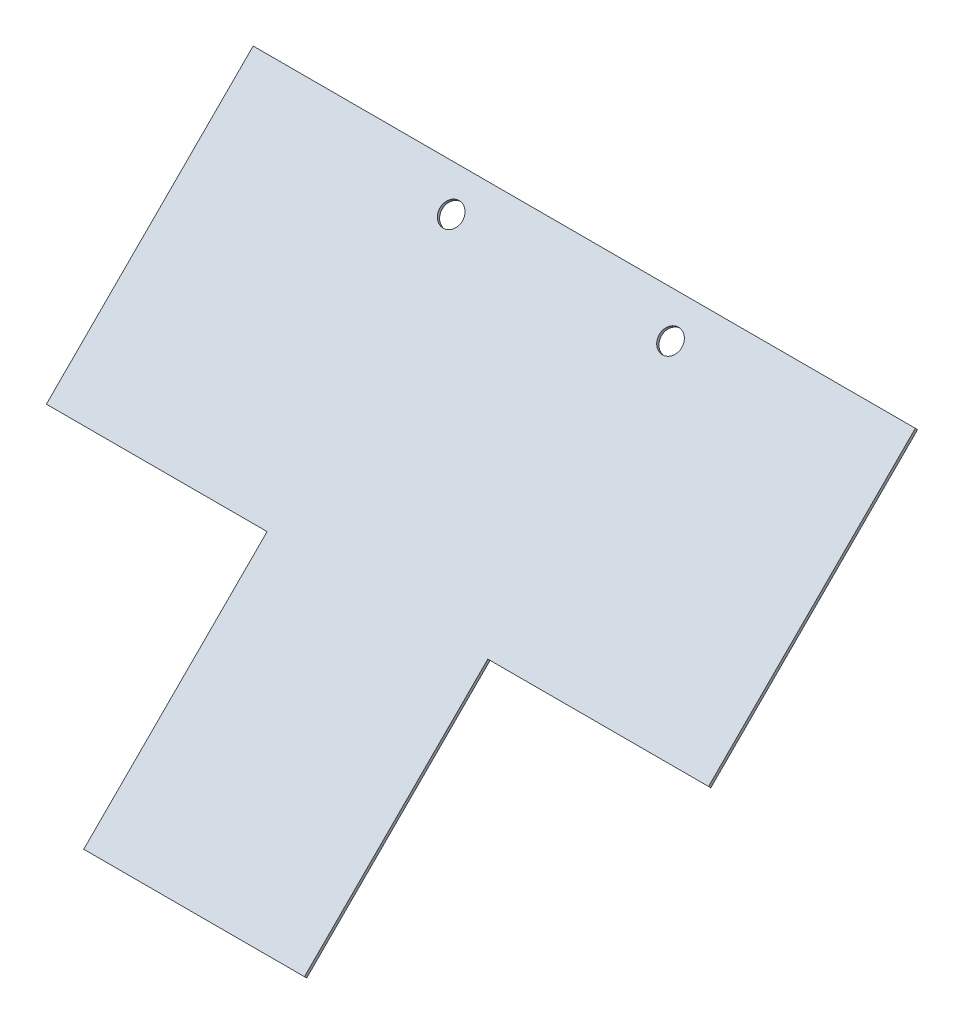
ISO-10303-21;
HEADER;
FILE_DESCRIPTION(('STEP AP214'),'2;1');
FILE_NAME('part.step','',(''),(''),'','','');
FILE_SCHEMA(('AUTOMOTIVE_DESIGN { 1 0 10303 214 1 1 1 1 }'));
ENDSEC;
DATA;
#1=APPLICATION_CONTEXT('core data for automotive mechanical design processes');
#2=APPLICATION_PROTOCOL_DEFINITION('international standard','automotive_design',2000,#1);
#3=PRODUCT_CONTEXT('',#1,'mechanical');
#4=PRODUCT('Part','Part','',(#3));
#5=PRODUCT_RELATED_PRODUCT_CATEGORY('part','',(#4));
#6=PRODUCT_DEFINITION_FORMATION('','',#4);
#7=PRODUCT_DEFINITION_CONTEXT('part definition',#1,'design');
#8=PRODUCT_DEFINITION('design','',#6,#7);
#9=PRODUCT_DEFINITION_SHAPE('','',#8);
#10=(LENGTH_UNIT() NAMED_UNIT(*) SI_UNIT(.MILLI.,.METRE.));
#11=(NAMED_UNIT(*) PLANE_ANGLE_UNIT() SI_UNIT($,.RADIAN.));
#12=(NAMED_UNIT(*) SI_UNIT($,.STERADIAN.) SOLID_ANGLE_UNIT());
#13=UNCERTAINTY_MEASURE_WITH_UNIT(LENGTH_MEASURE(1.E-05),#10,'distance_accuracy_value','');
#14=(GEOMETRIC_REPRESENTATION_CONTEXT(3) GLOBAL_UNCERTAINTY_ASSIGNED_CONTEXT((#13)) GLOBAL_UNIT_ASSIGNED_CONTEXT((#10,
#11,#12)) REPRESENTATION_CONTEXT('',''));
#15=CARTESIAN_POINT('',(0.,0.,0.));
#16=DIRECTION('',(0.,0.,1.));
#17=DIRECTION('',(1.,0.,0.));
#18=AXIS2_PLACEMENT_3D('',#15,#16,#17);
#19=CARTESIAN_POINT('',(0.,-40.8090250696297,-16.6460846404145));
#20=DIRECTION('',(0.,-0.707106781186546,-0.707106781186549));
#21=DIRECTION('',(0.,0.707106781186549,-0.707106781186546));
#22=AXIS2_PLACEMENT_3D('',#19,#20,#21);
#23=PLANE('',#22);
#24=CARTESIAN_POINT('',(50.96002,43.6053824684205,-101.060492178464));
#25=DIRECTION('',(0.,0.707106781186546,0.707106781186549));
#26=DIRECTION('',(0.,-0.707106781186549,0.707106781186547));
#27=AXIS2_PLACEMENT_3D('',#24,#25,#26);
#28=CIRCLE('',#27,2.59999999999998);
#29=CARTESIAN_POINT('',(50.96002,41.7669048373355,-99.2220145473794));
#30=VERTEX_POINT('',#29);
#31=EDGE_CURVE('E189',#30,#30,#28,.T.);
#32=ORIENTED_EDGE('',*,*,#31,.F.);
#33=EDGE_LOOP('',(#32));
#34=FACE_BOUND('',#33,.T.);
#35=CARTESIAN_POINT('',(101.43998,43.6053824684205,-101.060492178464));
#36=DIRECTION('',(0.,0.707106781186546,0.707106781186549));
#37=DIRECTION('',(0.,0.707106781186549,-0.707106781186547));
#38=AXIS2_PLACEMENT_3D('',#35,#36,#37);
#39=CIRCLE('',#38,2.59999999999999);
#40=CARTESIAN_POINT('',(101.43998,45.4438600995055,-102.898969809549));
#41=VERTEX_POINT('',#40);
#42=EDGE_CURVE('E186',#41,#41,#39,.T.);
#43=ORIENTED_EDGE('',*,*,#42,.F.);
#44=EDGE_LOOP('',(#43));
#45=FACE_BOUND('',#44,.T.);
#46=DIRECTION('',(-1.,0.,0.));
#47=VECTOR('',#46,1.);
#48=CARTESIAN_POINT('',(0.,48.9935361410621,-106.448645851106));
#49=LINE('',#48,#47);
#50=CARTESIAN_POINT('',(152.4,48.9935361410621,-106.448645851106));
#51=VERTEX_POINT('',#50);
#52=CARTESIAN_POINT('',(0.,48.9935361410621,-106.448645851106));
#53=VERTEX_POINT('',#52);
#54=EDGE_CURVE('E65',#51,#53,#49,.T.);
#55=ORIENTED_EDGE('',*,*,#54,.T.);
#56=DIRECTION('',(0.,-0.707106781186549,0.707106781186546));
#57=VECTOR('',#56,1.);
#58=CARTESIAN_POINT('',(0.,-40.8090250696297,-16.6460846404145));
#59=LINE('',#58,#57);
#60=CARTESIAN_POINT('',(0.,1.39817869939543,-58.8532884094394));
#61=VERTEX_POINT('',#60);
#62=EDGE_CURVE('E177',#53,#61,#59,.T.);
#63=ORIENTED_EDGE('',*,*,#62,.T.);
#64=DIRECTION('',(-1.,0.,0.));
#65=VECTOR('',#64,1.);
#66=CARTESIAN_POINT('',(50.8,1.39817869939542,-58.8532884094394));
#67=LINE('',#66,#65);
#68=CARTESIAN_POINT('',(50.8,1.39817869939542,-58.8532884094394));
#69=VERTEX_POINT('',#68);
#70=EDGE_CURVE('E114',#69,#61,#67,.T.);
#71=ORIENTED_EDGE('',*,*,#70,.F.);
#72=DIRECTION('',(0.,0.707106781186549,-0.707106781186547));
#73=VECTOR('',#72,1.);
#74=CARTESIAN_POINT('',(50.8,1.39817869939542,-58.8532884094394));
#75=LINE('',#74,#73);
#76=CARTESIAN_POINT('',(50.8,-40.8090250696297,-16.6460846404145));
#77=VERTEX_POINT('',#76);
#78=EDGE_CURVE('E73',#77,#69,#75,.T.);
#79=ORIENTED_EDGE('',*,*,#78,.F.);
#80=DIRECTION('',(1.,0.,0.));
#81=VECTOR('',#80,1.);
#82=CARTESIAN_POINT('',(0.,-40.8090250696297,-16.6460846404145));
#83=LINE('',#82,#81);
#84=CARTESIAN_POINT('',(101.6,-40.8090250696297,-16.6460846404145));
#85=VERTEX_POINT('',#84);
#86=EDGE_CURVE('E157',#77,#85,#83,.T.);
#87=ORIENTED_EDGE('',*,*,#86,.T.);
#88=DIRECTION('',(0.,-0.707106781186549,0.707106781186547));
#89=VECTOR('',#88,1.);
#90=CARTESIAN_POINT('',(101.6,1.39817869939542,-58.8532884094394));
#91=LINE('',#90,#89);
#92=CARTESIAN_POINT('',(101.6,1.39817869939542,-58.8532884094394));
#93=VERTEX_POINT('',#92);
#94=EDGE_CURVE('E142',#93,#85,#91,.T.);
#95=ORIENTED_EDGE('',*,*,#94,.F.);
#96=DIRECTION('',(-1.,0.,0.));
#97=VECTOR('',#96,1.);
#98=CARTESIAN_POINT('',(101.6,1.39817869939542,-58.8532884094394));
#99=LINE('',#98,#97);
#100=CARTESIAN_POINT('',(152.4,1.39817869939544,-58.8532884094394));
#101=VERTEX_POINT('',#100);
#102=EDGE_CURVE('E95',#101,#93,#99,.T.);
#103=ORIENTED_EDGE('',*,*,#102,.F.);
#104=DIRECTION('',(0.,0.707106781186549,-0.707106781186547));
#105=VECTOR('',#104,1.);
#106=CARTESIAN_POINT('',(152.4,-40.8090250696297,-16.6460846404144));
#107=LINE('',#106,#105);
#108=EDGE_CURVE('E168',#101,#51,#107,.T.);
#109=ORIENTED_EDGE('',*,*,#108,.T.);
#110=EDGE_LOOP('',(#55,#63,#71,#79,#87,#95,#103,#109));
#111=FACE_BOUND('',#110,.T.);
#112=ADVANCED_FACE('F57',(#34,#45,#111),#23,.F.);
#113=CARTESIAN_POINT('',(50.8,0.877323844373404,-59.3741432644614));
#114=DIRECTION('',(0.,0.707106781186549,-0.707106781186547));
#115=DIRECTION('',(-1.,0.,0.));
#116=AXIS2_PLACEMENT_3D('',#113,#114,#115);
#117=PLANE('',#116);
#118=ORIENTED_EDGE('',*,*,#70,.T.);
#119=DIRECTION('',(0.,0.707106781186546,0.707106781186549));
#120=VECTOR('',#119,1.);
#121=CARTESIAN_POINT('',(0.,0.877323844373418,-59.3741432644615));
#122=LINE('',#121,#120);
#123=CARTESIAN_POINT('',(0.,0.877323844373418,-59.3741432644615));
#124=VERTEX_POINT('',#123);
#125=EDGE_CURVE('E167',#124,#61,#122,.T.);
#126=ORIENTED_EDGE('',*,*,#125,.F.);
#127=DIRECTION('',(-1.,0.,0.));
#128=VECTOR('',#127,1.);
#129=CARTESIAN_POINT('',(50.8,0.877323844373404,-59.3741432644614));
#130=LINE('',#129,#128);
#131=CARTESIAN_POINT('',(50.8,0.877323844373404,-59.3741432644614));
#132=VERTEX_POINT('',#131);
#133=EDGE_CURVE('E60',#132,#124,#130,.T.);
#134=ORIENTED_EDGE('',*,*,#133,.F.);
#135=DIRECTION('',(0.,0.707106781186546,0.707106781186549));
#136=VECTOR('',#135,1.);
#137=CARTESIAN_POINT('',(50.8,0.877323844373404,-59.3741432644614));
#138=LINE('',#137,#136);
#139=EDGE_CURVE('E184',#132,#69,#138,.T.);
#140=ORIENTED_EDGE('',*,*,#139,.T.);
#141=EDGE_LOOP('',(#118,#126,#134,#140));
#142=FACE_BOUND('',#141,.T.);
#143=ADVANCED_FACE('F210',(#142),#117,.F.);
#144=CARTESIAN_POINT('',(0.,-41.3298799246517,-17.1669394954365));
#145=DIRECTION('',(0.,-0.707106781186546,-0.707106781186549));
#146=DIRECTION('',(0.,0.707106781186549,-0.707106781186547));
#147=AXIS2_PLACEMENT_3D('',#144,#145,#146);
#148=PLANE('',#147);
#149=ORIENTED_EDGE('',*,*,#133,.T.);
#150=DIRECTION('',(0.,-0.707106781186549,0.707106781186546));
#151=VECTOR('',#150,1.);
#152=CARTESIAN_POINT('',(0.,-41.3298799246517,-17.1669394954365));
#153=LINE('',#152,#151);
#154=CARTESIAN_POINT('',(0.,48.47268128604,-106.969500706128));
#155=VERTEX_POINT('',#154);
#156=EDGE_CURVE('E180',#155,#124,#153,.T.);
#157=ORIENTED_EDGE('',*,*,#156,.F.);
#158=DIRECTION('',(-1.,0.,0.));
#159=VECTOR('',#158,1.);
#160=CARTESIAN_POINT('',(0.,48.47268128604,-106.969500706128));
#161=LINE('',#160,#159);
#162=CARTESIAN_POINT('',(152.4,48.4726812860401,-106.969500706128));
#163=VERTEX_POINT('',#162);
#164=EDGE_CURVE('E12',#163,#155,#161,.T.);
#165=ORIENTED_EDGE('',*,*,#164,.F.);
#166=DIRECTION('',(0.,0.707106781186549,-0.707106781186547));
#167=VECTOR('',#166,1.);
#168=CARTESIAN_POINT('',(152.4,-41.3298799246517,-17.1669394954364));
#169=LINE('',#168,#167);
#170=CARTESIAN_POINT('',(152.4,0.877323844373425,-59.3741432644614));
#171=VERTEX_POINT('',#170);
#172=EDGE_CURVE('E173',#171,#163,#169,.T.);
#173=ORIENTED_EDGE('',*,*,#172,.F.);
#174=DIRECTION('',(-1.,0.,0.));
#175=VECTOR('',#174,1.);
#176=CARTESIAN_POINT('',(101.6,0.877323844373411,-59.3741432644614));
#177=LINE('',#176,#175);
#178=CARTESIAN_POINT('',(101.6,0.877323844373411,-59.3741432644614));
#179=VERTEX_POINT('',#178);
#180=EDGE_CURVE('E151',#171,#179,#177,.T.);
#181=ORIENTED_EDGE('',*,*,#180,.T.);
#182=DIRECTION('',(0.,-0.707106781186549,0.707106781186547));
#183=VECTOR('',#182,1.);
#184=CARTESIAN_POINT('',(101.6,0.877323844373411,-59.3741432644614));
#185=LINE('',#184,#183);
#186=CARTESIAN_POINT('',(101.6,-41.3298799246517,-17.1669394954365));
#187=VERTEX_POINT('',#186);
#188=EDGE_CURVE('E146',#179,#187,#185,.T.);
#189=ORIENTED_EDGE('',*,*,#188,.T.);
#190=DIRECTION('',(1.,0.,0.));
#191=VECTOR('',#190,1.);
#192=CARTESIAN_POINT('',(0.,-41.3298799246517,-17.1669394954365));
#193=LINE('',#192,#191);
#194=CARTESIAN_POINT('',(50.8,-41.3298799246517,-17.1669394954365));
#195=VERTEX_POINT('',#194);
#196=EDGE_CURVE('E150',#195,#187,#193,.T.);
#197=ORIENTED_EDGE('',*,*,#196,.F.);
#198=DIRECTION('',(0.,0.707106781186549,-0.707106781186547));
#199=VECTOR('',#198,1.);
#200=CARTESIAN_POINT('',(50.8,0.877323844373404,-59.3741432644614));
#201=LINE('',#200,#199);
#202=EDGE_CURVE('E82',#195,#132,#201,.T.);
#203=ORIENTED_EDGE('',*,*,#202,.T.);
#204=EDGE_LOOP('',(#149,#157,#165,#173,#181,#189,#197,#203));
#205=FACE_BOUND('',#204,.T.);
#206=CARTESIAN_POINT('',(50.96002,43.0845276133985,-101.581347033486));
#207=DIRECTION('',(0.,-0.707106781186546,-0.707106781186549));
#208=DIRECTION('',(0.,0.707106781186549,-0.707106781186547));
#209=AXIS2_PLACEMENT_3D('',#206,#207,#208);
#210=CIRCLE('',#209,2.59999999999998);
#211=CARTESIAN_POINT('',(50.96002,44.9230052444835,-103.419824664571));
#212=VERTEX_POINT('',#211);
#213=EDGE_CURVE('E197',#212,#212,#210,.T.);
#214=ORIENTED_EDGE('',*,*,#213,.F.);
#215=EDGE_LOOP('',(#214));
#216=FACE_BOUND('',#215,.T.);
#217=CARTESIAN_POINT('',(101.43998,43.0845276133985,-101.581347033486));
#218=DIRECTION('',(0.,-0.707106781186546,-0.707106781186549));
#219=DIRECTION('',(0.,0.707106781186549,-0.707106781186547));
#220=AXIS2_PLACEMENT_3D('',#217,#218,#219);
#221=CIRCLE('',#220,2.59999999999999);
#222=CARTESIAN_POINT('',(101.43998,44.9230052444835,-103.419824664571));
#223=VERTEX_POINT('',#222);
#224=EDGE_CURVE('E192',#223,#223,#221,.T.);
#225=ORIENTED_EDGE('',*,*,#224,.F.);
#226=EDGE_LOOP('',(#225));
#227=FACE_BOUND('',#226,.T.);
#228=ADVANCED_FACE('F147',(#205,#216,#227),#148,.T.);
#229=CARTESIAN_POINT('',(0.,48.47268128604,-106.969500706128));
#230=DIRECTION('',(0.,0.707106781186549,-0.707106781186547));
#231=DIRECTION('',(-1.,0.,0.));
#232=AXIS2_PLACEMENT_3D('',#229,#230,#231);
#233=PLANE('',#232);
#234=ORIENTED_EDGE('',*,*,#164,.T.);
#235=DIRECTION('',(0.,0.707106781186546,0.707106781186549));
#236=VECTOR('',#235,1.);
#237=CARTESIAN_POINT('',(0.,48.47268128604,-106.969500706128));
#238=LINE('',#237,#236);
#239=EDGE_CURVE('E175',#155,#53,#238,.T.);
#240=ORIENTED_EDGE('',*,*,#239,.T.);
#241=ORIENTED_EDGE('',*,*,#54,.F.);
#242=DIRECTION('',(0.,0.707106781186547,0.707106781186549));
#243=VECTOR('',#242,1.);
#244=CARTESIAN_POINT('',(152.4,48.4726812860401,-106.969500706128));
#245=LINE('',#244,#243);
#246=EDGE_CURVE('E170',#163,#51,#245,.T.);
#247=ORIENTED_EDGE('',*,*,#246,.F.);
#248=EDGE_LOOP('',(#234,#240,#241,#247));
#249=FACE_BOUND('',#248,.T.);
#250=ADVANCED_FACE('F207',(#249),#233,.T.);
#251=CARTESIAN_POINT('',(101.6,0.877323844373411,-59.3741432644614));
#252=DIRECTION('',(-1.,0.,0.));
#253=DIRECTION('',(0.,-0.707106781186549,0.707106781186547));
#254=AXIS2_PLACEMENT_3D('',#251,#252,#253);
#255=PLANE('',#254);
#256=ORIENTED_EDGE('',*,*,#94,.T.);
#257=DIRECTION('',(0.,0.707106781186547,0.707106781186549));
#258=VECTOR('',#257,1.);
#259=CARTESIAN_POINT('',(101.6,-41.3298799246517,-17.1669394954365));
#260=LINE('',#259,#258);
#261=EDGE_CURVE('E153',#187,#85,#260,.T.);
#262=ORIENTED_EDGE('',*,*,#261,.F.);
#263=ORIENTED_EDGE('',*,*,#188,.F.);
#264=DIRECTION('',(0.,0.707106781186546,0.707106781186549));
#265=VECTOR('',#264,1.);
#266=CARTESIAN_POINT('',(101.6,0.877323844373411,-59.3741432644614));
#267=LINE('',#266,#265);
#268=EDGE_CURVE('E187',#179,#93,#267,.T.);
#269=ORIENTED_EDGE('',*,*,#268,.T.);
#270=EDGE_LOOP('',(#256,#262,#263,#269));
#271=FACE_BOUND('',#270,.T.);
#272=ADVANCED_FACE('F154',(#271),#255,.F.);
#273=CARTESIAN_POINT('',(50.8,0.877323844373404,-59.3741432644614));
#274=DIRECTION('',(1.,0.,0.));
#275=DIRECTION('',(0.,0.707106781186549,-0.707106781186547));
#276=AXIS2_PLACEMENT_3D('',#273,#274,#275);
#277=PLANE('',#276);
#278=ORIENTED_EDGE('',*,*,#202,.F.);
#279=DIRECTION('',(0.,0.707106781186547,0.707106781186549));
#280=VECTOR('',#279,1.);
#281=CARTESIAN_POINT('',(50.8,-41.3298799246517,-17.1669394954365));
#282=LINE('',#281,#280);
#283=EDGE_CURVE('E161',#195,#77,#282,.T.);
#284=ORIENTED_EDGE('',*,*,#283,.T.);
#285=ORIENTED_EDGE('',*,*,#78,.T.);
#286=ORIENTED_EDGE('',*,*,#139,.F.);
#287=EDGE_LOOP('',(#278,#284,#285,#286));
#288=FACE_BOUND('',#287,.T.);
#289=ADVANCED_FACE('F211',(#288),#277,.F.);
#290=CARTESIAN_POINT('',(101.43998,41.8093312442067,-102.856543402678));
#291=DIRECTION('',(0.,0.707106781186546,0.707106781186549));
#292=DIRECTION('',(0.,-0.707106781186549,0.707106781186547));
#293=AXIS2_PLACEMENT_3D('',#290,#291,#292);
#294=CYLINDRICAL_SURFACE('',#293,2.59999999999999);
#295=ORIENTED_EDGE('',*,*,#224,.T.);
#296=EDGE_LOOP('',(#295));
#297=FACE_BOUND('',#296,.T.);
#298=ORIENTED_EDGE('',*,*,#42,.T.);
#299=EDGE_LOOP('',(#298));
#300=FACE_BOUND('',#299,.T.);
#301=ADVANCED_FACE('F214',(#297,#300),#294,.F.);
#302=CARTESIAN_POINT('',(50.96002,41.8093312442067,-102.856543402678));
#303=DIRECTION('',(0.,0.707106781186546,0.707106781186549));
#304=DIRECTION('',(0.,-0.707106781186549,0.707106781186547));
#305=AXIS2_PLACEMENT_3D('',#302,#303,#304);
#306=CYLINDRICAL_SURFACE('',#305,2.59999999999998);
#307=ORIENTED_EDGE('',*,*,#213,.T.);
#308=EDGE_LOOP('',(#307));
#309=FACE_BOUND('',#308,.T.);
#310=ORIENTED_EDGE('',*,*,#31,.T.);
#311=EDGE_LOOP('',(#310));
#312=FACE_BOUND('',#311,.T.);
#313=ADVANCED_FACE('F220',(#309,#312),#306,.F.);
#314=CARTESIAN_POINT('',(101.6,0.877323844373411,-59.3741432644614));
#315=DIRECTION('',(0.,0.707106781186549,-0.707106781186547));
#316=DIRECTION('',(-1.,0.,0.));
#317=AXIS2_PLACEMENT_3D('',#314,#315,#316);
#318=PLANE('',#317);
#319=ORIENTED_EDGE('',*,*,#180,.F.);
#320=DIRECTION('',(0.,0.707106781186547,0.707106781186549));
#321=VECTOR('',#320,1.);
#322=CARTESIAN_POINT('',(152.4,0.877323844373425,-59.3741432644614));
#323=LINE('',#322,#321);
#324=EDGE_CURVE('E165',#171,#101,#323,.T.);
#325=ORIENTED_EDGE('',*,*,#324,.T.);
#326=ORIENTED_EDGE('',*,*,#102,.T.);
#327=ORIENTED_EDGE('',*,*,#268,.F.);
#328=EDGE_LOOP('',(#319,#325,#326,#327));
#329=FACE_BOUND('',#328,.T.);
#330=ADVANCED_FACE('F237',(#329),#318,.F.);
#331=CARTESIAN_POINT('',(0.,-41.3298799246517,-17.1669394954365));
#332=DIRECTION('',(-1.,0.,0.));
#333=DIRECTION('',(0.,-0.707106781186549,0.707106781186546));
#334=AXIS2_PLACEMENT_3D('',#331,#332,#333);
#335=PLANE('',#334);
#336=ORIENTED_EDGE('',*,*,#125,.T.);
#337=ORIENTED_EDGE('',*,*,#62,.F.);
#338=ORIENTED_EDGE('',*,*,#239,.F.);
#339=ORIENTED_EDGE('',*,*,#156,.T.);
#340=EDGE_LOOP('',(#336,#337,#338,#339));
#341=FACE_BOUND('',#340,.T.);
#342=ADVANCED_FACE('F209',(#341),#335,.T.);
#343=CARTESIAN_POINT('',(152.4,-41.3298799246517,-17.1669394954364));
#344=DIRECTION('',(1.,0.,0.));
#345=DIRECTION('',(0.,0.707106781186549,-0.707106781186547));
#346=AXIS2_PLACEMENT_3D('',#343,#344,#345);
#347=PLANE('',#346);
#348=ORIENTED_EDGE('',*,*,#324,.F.);
#349=ORIENTED_EDGE('',*,*,#172,.T.);
#350=ORIENTED_EDGE('',*,*,#246,.T.);
#351=ORIENTED_EDGE('',*,*,#108,.F.);
#352=EDGE_LOOP('',(#348,#349,#350,#351));
#353=FACE_BOUND('',#352,.T.);
#354=ADVANCED_FACE('F246',(#353),#347,.T.);
#355=CARTESIAN_POINT('',(0.,-41.3298799246517,-17.1669394954365));
#356=DIRECTION('',(0.,-0.707106781186549,0.707106781186547));
#357=DIRECTION('',(1.,0.,0.));
#358=AXIS2_PLACEMENT_3D('',#355,#356,#357);
#359=PLANE('',#358);
#360=ORIENTED_EDGE('',*,*,#283,.F.);
#361=ORIENTED_EDGE('',*,*,#196,.T.);
#362=ORIENTED_EDGE('',*,*,#261,.T.);
#363=ORIENTED_EDGE('',*,*,#86,.F.);
#364=EDGE_LOOP('',(#360,#361,#362,#363));
#365=FACE_BOUND('',#364,.T.);
#366=ADVANCED_FACE('F160',(#365),#359,.T.);
#367=CLOSED_SHELL('',(#112,#143,#228,#250,#272,#289,#301,#313,#330,#342,#354,#366));
#368=MANIFOLD_SOLID_BREP('B2',#367);
#369=ADVANCED_BREP_SHAPE_REPRESENTATION('',(#18,#368),#14);
#370=SHAPE_DEFINITION_REPRESENTATION(#9,#369);
ENDSEC;
END-ISO-10303-21;
